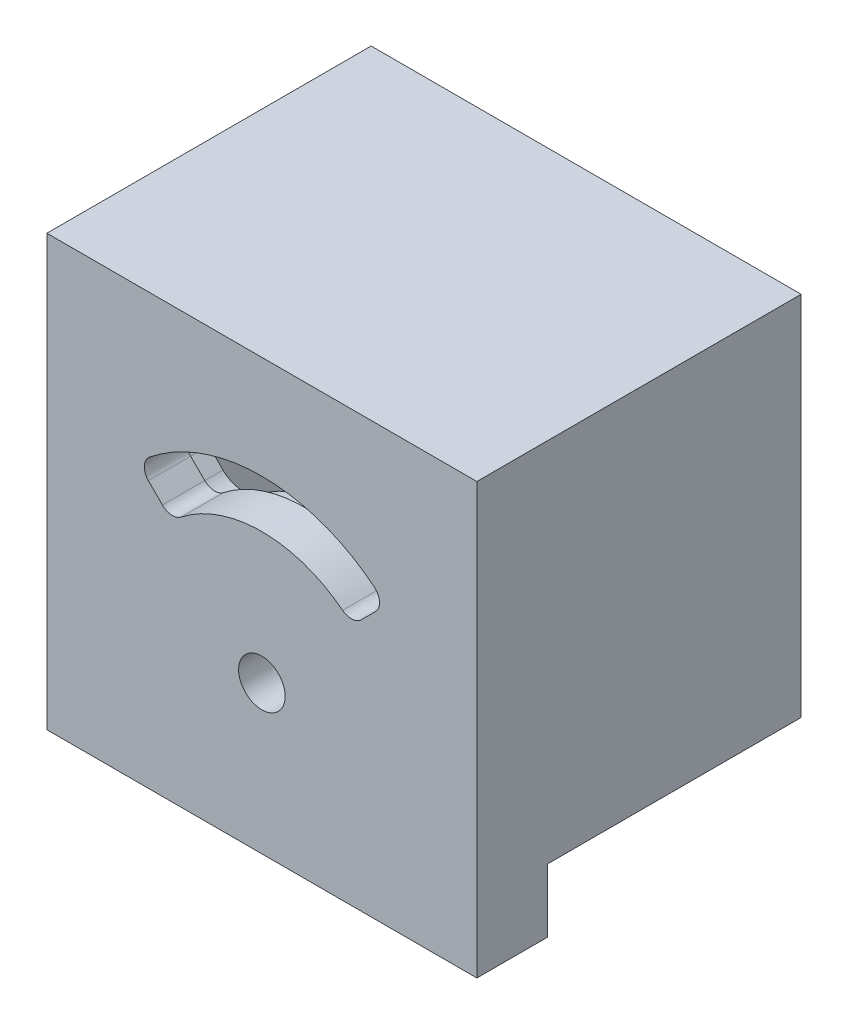
ISO-10303-21;
HEADER;
FILE_DESCRIPTION(('STEP AP214'),'2;1');
FILE_NAME('part.step','',(''),(''),'','','');
FILE_SCHEMA(('AUTOMOTIVE_DESIGN { 1 0 10303 214 1 1 1 1 }'));
ENDSEC;
DATA;
#1=APPLICATION_CONTEXT('core data for automotive mechanical design processes');
#2=APPLICATION_PROTOCOL_DEFINITION('international standard','automotive_design',2000,#1);
#3=PRODUCT_CONTEXT('',#1,'mechanical');
#4=PRODUCT('Part','Part','',(#3));
#5=PRODUCT_RELATED_PRODUCT_CATEGORY('part','',(#4));
#6=PRODUCT_DEFINITION_FORMATION('','',#4);
#7=PRODUCT_DEFINITION_CONTEXT('part definition',#1,'design');
#8=PRODUCT_DEFINITION('design','',#6,#7);
#9=PRODUCT_DEFINITION_SHAPE('','',#8);
#10=(LENGTH_UNIT() NAMED_UNIT(*) SI_UNIT(.MILLI.,.METRE.));
#11=(NAMED_UNIT(*) PLANE_ANGLE_UNIT() SI_UNIT($,.RADIAN.));
#12=(NAMED_UNIT(*) SI_UNIT($,.STERADIAN.) SOLID_ANGLE_UNIT());
#13=UNCERTAINTY_MEASURE_WITH_UNIT(LENGTH_MEASURE(1.E-05),#10,'distance_accuracy_value','');
#14=(GEOMETRIC_REPRESENTATION_CONTEXT(3) GLOBAL_UNCERTAINTY_ASSIGNED_CONTEXT((#13)) GLOBAL_UNIT_ASSIGNED_CONTEXT((#10,
#11,#12)) REPRESENTATION_CONTEXT('',''));
#15=CARTESIAN_POINT('',(0.,0.,0.));
#16=DIRECTION('',(0.,0.,1.));
#17=DIRECTION('',(1.,0.,0.));
#18=AXIS2_PLACEMENT_3D('',#15,#16,#17);
#19=CARTESIAN_POINT('',(0.,-1.09875,-5.));
#20=DIRECTION('',(0.,0.,-1.));
#21=DIRECTION('',(1.,0.,0.));
#22=AXIS2_PLACEMENT_3D('',#19,#20,#21);
#23=PLANE('',#22);
#24=CARTESIAN_POINT('',(0.,-4.75,-5.));
#25=DIRECTION('',(0.,0.,-1.));
#26=DIRECTION('',(-1.,0.,0.));
#27=AXIS2_PLACEMENT_3D('',#24,#25,#26);
#28=CIRCLE('',#27,1.65);
#29=CARTESIAN_POINT('',(-1.65,-4.75,-5.));
#30=VERTEX_POINT('',#29);
#31=EDGE_CURVE('E498',#30,#30,#28,.T.);
#32=ORIENTED_EDGE('',*,*,#31,.F.);
#33=EDGE_LOOP('',(#32));
#34=FACE_BOUND('',#33,.T.);
#35=CARTESIAN_POINT('',(0.,-4.75,-5.));
#36=DIRECTION('',(0.,0.,-1.));
#37=DIRECTION('',(-1.,0.,0.));
#38=AXIS2_PLACEMENT_3D('',#35,#36,#37);
#39=CIRCLE('',#38,8.3);
#40=CARTESIAN_POINT('',(-5.11380936571649,1.78750363450073,-5.));
#41=VERTEX_POINT('',#40);
#42=CARTESIAN_POINT('',(5.11380936571649,1.78750363450073,-5.));
#43=VERTEX_POINT('',#42);
#44=EDGE_CURVE('E490',#41,#43,#39,.T.);
#45=ORIENTED_EDGE('',*,*,#44,.T.);
#46=CARTESIAN_POINT('',(6.34605258637106,3.36280571510332,-5.));
#47=DIRECTION('',(0.,0.,1.));
#48=DIRECTION('',(-1.,0.,0.));
#49=AXIS2_PLACEMENT_3D('',#46,#47,#48);
#50=CIRCLE('',#49,2.);
#51=CARTESIAN_POINT('',(7.76026614874416,1.94859215273023,-5.));
#52=VERTEX_POINT('',#51);
#53=EDGE_CURVE('E488',#43,#52,#50,.T.);
#54=ORIENTED_EDGE('',*,*,#53,.T.);
#55=DIRECTION('',(-0.707106781186548,-0.707106781186548,0.));
#56=VECTOR('',#55,1.);
#57=CARTESIAN_POINT('',(8.25847771681434,2.44680372080041,-5.));
#58=LINE('',#57,#56);
#59=CARTESIAN_POINT('',(8.75668928488452,2.94501528887059,-5.));
#60=VERTEX_POINT('',#59);
#61=EDGE_CURVE('E485',#60,#52,#58,.T.);
#62=ORIENTED_EDGE('',*,*,#61,.F.);
#63=CARTESIAN_POINT('',(7.34247572251143,4.35922885124369,-5.));
#64=DIRECTION('',(0.,0.,1.));
#65=DIRECTION('',(-1.,0.,0.));
#66=AXIS2_PLACEMENT_3D('',#63,#64,#65);
#67=CIRCLE('',#66,2.);
#68=CARTESIAN_POINT('',(8.59759977764159,5.91636198820842,-5.));
#69=VERTEX_POINT('',#68);
#70=EDGE_CURVE('E483',#60,#69,#67,.T.);
#71=ORIENTED_EDGE('',*,*,#70,.T.);
#72=CARTESIAN_POINT('',(0.,-4.75,-5.));
#73=DIRECTION('',(0.,0.,-1.));
#74=DIRECTION('',(-1.,0.,0.));
#75=AXIS2_PLACEMENT_3D('',#72,#73,#74);
#76=CIRCLE('',#75,13.7);
#77=CARTESIAN_POINT('',(-8.59759977764158,5.91636198820842,-5.));
#78=VERTEX_POINT('',#77);
#79=EDGE_CURVE('E480',#78,#69,#76,.T.);
#80=ORIENTED_EDGE('',*,*,#79,.F.);
#81=CARTESIAN_POINT('',(-7.34247572251143,4.35922885124368,-5.));
#82=DIRECTION('',(0.,0.,1.));
#83=DIRECTION('',(-1.,0.,0.));
#84=AXIS2_PLACEMENT_3D('',#81,#82,#83);
#85=CIRCLE('',#84,2.);
#86=CARTESIAN_POINT('',(-8.75668928488452,2.94501528887058,-5.));
#87=VERTEX_POINT('',#86);
#88=EDGE_CURVE('E478',#78,#87,#85,.T.);
#89=ORIENTED_EDGE('',*,*,#88,.T.);
#90=DIRECTION('',(0.707106781186547,-0.707106781186548,0.));
#91=VECTOR('',#90,1.);
#92=CARTESIAN_POINT('',(-8.25847771681434,2.44680372080041,-5.));
#93=LINE('',#92,#91);
#94=CARTESIAN_POINT('',(-7.76026614874417,1.94859215273023,-5.));
#95=VERTEX_POINT('',#94);
#96=EDGE_CURVE('E476',#87,#95,#93,.T.);
#97=ORIENTED_EDGE('',*,*,#96,.T.);
#98=CARTESIAN_POINT('',(-6.34605258637107,3.36280571510332,-5.));
#99=DIRECTION('',(0.,0.,1.));
#100=DIRECTION('',(-1.,0.,0.));
#101=AXIS2_PLACEMENT_3D('',#98,#99,#100);
#102=CIRCLE('',#101,2.);
#103=EDGE_CURVE('E474',#95,#41,#102,.T.);
#104=ORIENTED_EDGE('',*,*,#103,.T.);
#105=EDGE_LOOP('',(#45,#54,#62,#71,#80,#89,#97,#104));
#106=FACE_BOUND('',#105,.T.);
#107=DIRECTION('',(0.,1.,0.));
#108=VECTOR('',#107,1.);
#109=CARTESIAN_POINT('',(12.25,15.25,-5.));
#110=LINE('',#109,#108);
#111=CARTESIAN_POINT('',(12.25,-10.75,-5.));
#112=VERTEX_POINT('',#111);
#113=CARTESIAN_POINT('',(12.25,12.25,-5.));
#114=VERTEX_POINT('',#113);
#115=EDGE_CURVE('E237',#112,#114,#110,.T.);
#116=ORIENTED_EDGE('',*,*,#115,.F.);
#117=DIRECTION('',(-1.,0.,0.));
#118=VECTOR('',#117,1.);
#119=CARTESIAN_POINT('',(15.25,-10.75,-5.));
#120=LINE('',#119,#118);
#121=CARTESIAN_POINT('',(15.25,-10.75,-5.));
#122=VERTEX_POINT('',#121);
#123=EDGE_CURVE('E885',#122,#112,#120,.T.);
#124=ORIENTED_EDGE('',*,*,#123,.F.);
#125=DIRECTION('',(0.,1.,0.));
#126=VECTOR('',#125,1.);
#127=CARTESIAN_POINT('',(15.25,-15.25,-5.));
#128=LINE('',#127,#126);
#129=CARTESIAN_POINT('',(15.25,-15.25,-5.));
#130=VERTEX_POINT('',#129);
#131=EDGE_CURVE('E242',#130,#122,#128,.T.);
#132=ORIENTED_EDGE('',*,*,#131,.F.);
#133=DIRECTION('',(1.,0.,0.));
#134=VECTOR('',#133,1.);
#135=CARTESIAN_POINT('',(-15.25,-15.25,-5.));
#136=LINE('',#135,#134);
#137=CARTESIAN_POINT('',(-15.25,-15.25,-5.));
#138=VERTEX_POINT('',#137);
#139=EDGE_CURVE('E493',#138,#130,#136,.T.);
#140=ORIENTED_EDGE('',*,*,#139,.F.);
#141=DIRECTION('',(0.,-1.,0.));
#142=VECTOR('',#141,1.);
#143=CARTESIAN_POINT('',(-15.25,15.25,-5.));
#144=LINE('',#143,#142);
#145=CARTESIAN_POINT('',(-15.25,-10.75,-5.));
#146=VERTEX_POINT('',#145);
#147=EDGE_CURVE('E41',#146,#138,#144,.T.);
#148=ORIENTED_EDGE('',*,*,#147,.F.);
#149=DIRECTION('',(-1.,0.,0.));
#150=VECTOR('',#149,1.);
#151=CARTESIAN_POINT('',(-12.25,-10.75,-5.));
#152=LINE('',#151,#150);
#153=CARTESIAN_POINT('',(-12.25,-10.75,-5.));
#154=VERTEX_POINT('',#153);
#155=EDGE_CURVE('E253',#154,#146,#152,.T.);
#156=ORIENTED_EDGE('',*,*,#155,.F.);
#157=DIRECTION('',(0.,-1.,0.));
#158=VECTOR('',#157,1.);
#159=CARTESIAN_POINT('',(-12.25,15.25,-5.));
#160=LINE('',#159,#158);
#161=CARTESIAN_POINT('',(-12.25,12.25,-5.));
#162=VERTEX_POINT('',#161);
#163=EDGE_CURVE('E245',#162,#154,#160,.T.);
#164=ORIENTED_EDGE('',*,*,#163,.F.);
#165=DIRECTION('',(-1.,0.,0.));
#166=VECTOR('',#165,1.);
#167=CARTESIAN_POINT('',(15.25,12.25,-5.));
#168=LINE('',#167,#166);
#169=EDGE_CURVE('E227',#114,#162,#168,.T.);
#170=ORIENTED_EDGE('',*,*,#169,.F.);
#171=EDGE_LOOP('',(#116,#124,#132,#140,#148,#156,#164,#170));
#172=FACE_BOUND('',#171,.T.);
#173=ADVANCED_FACE('F37',(#34,#106,#172),#23,.T.);
#174=CARTESIAN_POINT('',(15.25,12.25,-23.));
#175=DIRECTION('',(0.,1.,0.));
#176=DIRECTION('',(0.,0.,1.));
#177=AXIS2_PLACEMENT_3D('',#174,#175,#176);
#178=PLANE('',#177);
#179=DIRECTION('',(0.,0.,-1.));
#180=VECTOR('',#179,1.);
#181=CARTESIAN_POINT('',(12.25,12.25,-23.));
#182=LINE('',#181,#180);
#183=CARTESIAN_POINT('',(12.25,12.25,-23.));
#184=VERTEX_POINT('',#183);
#185=EDGE_CURVE('E243',#114,#184,#182,.T.);
#186=ORIENTED_EDGE('',*,*,#185,.F.);
#187=ORIENTED_EDGE('',*,*,#169,.T.);
#188=DIRECTION('',(0.,0.,1.));
#189=VECTOR('',#188,1.);
#190=CARTESIAN_POINT('',(-12.25,12.25,-23.));
#191=LINE('',#190,#189);
#192=CARTESIAN_POINT('',(-12.25,12.25,-23.));
#193=VERTEX_POINT('',#192);
#194=EDGE_CURVE('E264',#193,#162,#191,.T.);
#195=ORIENTED_EDGE('',*,*,#194,.F.);
#196=DIRECTION('',(-1.,0.,0.));
#197=VECTOR('',#196,1.);
#198=CARTESIAN_POINT('',(15.25,12.25,-23.));
#199=LINE('',#198,#197);
#200=EDGE_CURVE('E226',#184,#193,#199,.T.);
#201=ORIENTED_EDGE('',*,*,#200,.F.);
#202=EDGE_LOOP('',(#186,#187,#195,#201));
#203=FACE_BOUND('',#202,.T.);
#204=ADVANCED_FACE('F568',(#203),#178,.F.);
#205=CARTESIAN_POINT('',(0.,-4.75,-5.));
#206=DIRECTION('',(0.,0.,1.));
#207=DIRECTION('',(1.,0.,0.));
#208=AXIS2_PLACEMENT_3D('',#205,#206,#207);
#209=CYLINDRICAL_SURFACE('',#208,12.7);
#210=DIRECTION('',(0.,0.,1.));
#211=VECTOR('',#210,1.);
#212=CARTESIAN_POINT('',(-7.9700377500765,5.13779541972605,-5.));
#213=LINE('',#212,#211);
#214=CARTESIAN_POINT('',(-7.97003775007651,5.13779541972605,0.));
#215=VERTEX_POINT('',#214);
#216=CARTESIAN_POINT('',(-7.97003775007651,5.13779541972605,-3.));
#217=VERTEX_POINT('',#216);
#218=EDGE_CURVE('E11',#215,#217,#213,.F.);
#219=ORIENTED_EDGE('',*,*,#218,.T.);
#220=CARTESIAN_POINT('',(0.,-4.75,-3.));
#221=DIRECTION('',(0.,0.,-1.));
#222=DIRECTION('',(-1.,0.,0.));
#223=AXIS2_PLACEMENT_3D('',#220,#221,#222);
#224=CIRCLE('',#223,12.7);
#225=CARTESIAN_POINT('',(7.9700377500765,5.13779541972605,-3.));
#226=VERTEX_POINT('',#225);
#227=EDGE_CURVE('E47',#217,#226,#224,.T.);
#228=ORIENTED_EDGE('',*,*,#227,.T.);
#229=DIRECTION('',(0.,0.,1.));
#230=VECTOR('',#229,1.);
#231=CARTESIAN_POINT('',(7.97003775007651,5.13779541972605,-5.));
#232=LINE('',#231,#230);
#233=CARTESIAN_POINT('',(7.9700377500765,5.13779541972605,0.));
#234=VERTEX_POINT('',#233);
#235=EDGE_CURVE('E533',#226,#234,#232,.T.);
#236=ORIENTED_EDGE('',*,*,#235,.T.);
#237=CARTESIAN_POINT('',(0.,-4.75,0.));
#238=DIRECTION('',(0.,0.,-1.));
#239=DIRECTION('',(-1.,0.,0.));
#240=AXIS2_PLACEMENT_3D('',#237,#238,#239);
#241=CIRCLE('',#240,12.7);
#242=EDGE_CURVE('E530',#215,#234,#241,.T.);
#243=ORIENTED_EDGE('',*,*,#242,.F.);
#244=EDGE_LOOP('',(#219,#228,#236,#243));
#245=FACE_BOUND('',#244,.T.);
#246=ADVANCED_FACE('F39',(#245),#209,.F.);
#247=CARTESIAN_POINT('',(-8.18900691705113,3.79154648341029,-5.));
#248=DIRECTION('',(-0.707106781186548,-0.707106781186547,0.));
#249=DIRECTION('',(0.707106781186547,-0.707106781186548,0.));
#250=AXIS2_PLACEMENT_3D('',#247,#248,#249);
#251=PLANE('',#250);
#252=DIRECTION('',(0.707106781186547,-0.707106781186548,0.));
#253=VECTOR('',#252,1.);
#254=CARTESIAN_POINT('',(-8.18900691705113,3.79154648341029,-3.));
#255=LINE('',#254,#253);
#256=CARTESIAN_POINT('',(-8.04958250369797,3.65212207005713,-3.));
#257=VERTEX_POINT('',#256);
#258=CARTESIAN_POINT('',(-7.05315936755762,2.65569893391677,-3.));
#259=VERTEX_POINT('',#258);
#260=EDGE_CURVE('E527',#257,#259,#255,.T.);
#261=ORIENTED_EDGE('',*,*,#260,.F.);
#262=DIRECTION('',(0.,0.,1.));
#263=VECTOR('',#262,1.);
#264=CARTESIAN_POINT('',(-8.04958250369797,3.65212207005713,-5.));
#265=LINE('',#264,#263);
#266=CARTESIAN_POINT('',(-8.04958250369797,3.65212207005713,0.));
#267=VERTEX_POINT('',#266);
#268=EDGE_CURVE('E525',#257,#267,#265,.T.);
#269=ORIENTED_EDGE('',*,*,#268,.T.);
#270=DIRECTION('',(0.707106781186547,-0.707106781186548,0.));
#271=VECTOR('',#270,1.);
#272=CARTESIAN_POINT('',(-8.18900691705113,3.79154648341029,0.));
#273=LINE('',#272,#271);
#274=CARTESIAN_POINT('',(-7.05315936755762,2.65569893391677,0.));
#275=VERTEX_POINT('',#274);
#276=EDGE_CURVE('E523',#267,#275,#273,.T.);
#277=ORIENTED_EDGE('',*,*,#276,.T.);
#278=DIRECTION('',(0.,0.,-1.));
#279=VECTOR('',#278,1.);
#280=CARTESIAN_POINT('',(-7.05315936755762,2.65569893391677,-5.));
#281=LINE('',#280,#279);
#282=EDGE_CURVE('E521',#275,#259,#281,.T.);
#283=ORIENTED_EDGE('',*,*,#282,.T.);
#284=EDGE_LOOP('',(#261,#269,#277,#283));
#285=FACE_BOUND('',#284,.T.);
#286=ADVANCED_FACE('F590',(#285),#251,.F.);
#287=CARTESIAN_POINT('',(0.,-4.75,-5.));
#288=DIRECTION('',(0.,0.,1.));
#289=DIRECTION('',(1.,0.,0.));
#290=AXIS2_PLACEMENT_3D('',#287,#288,#289);
#291=CYLINDRICAL_SURFACE('',#290,9.3);
#292=CARTESIAN_POINT('',(0.,-4.75,-3.));
#293=DIRECTION('',(0.,0.,-1.));
#294=DIRECTION('',(-1.,0.,0.));
#295=AXIS2_PLACEMENT_3D('',#292,#293,#294);
#296=CIRCLE('',#295,9.3);
#297=CARTESIAN_POINT('',(-5.72993097604378,2.57515467480203,-3.));
#298=VERTEX_POINT('',#297);
#299=CARTESIAN_POINT('',(5.72993097604378,2.57515467480203,-3.));
#300=VERTEX_POINT('',#299);
#301=EDGE_CURVE('E518',#298,#300,#296,.T.);
#302=ORIENTED_EDGE('',*,*,#301,.F.);
#303=DIRECTION('',(0.,0.,1.));
#304=VECTOR('',#303,1.);
#305=CARTESIAN_POINT('',(-5.72993097604378,2.57515467480203,-5.));
#306=LINE('',#305,#304);
#307=CARTESIAN_POINT('',(-5.72993097604378,2.57515467480203,0.));
#308=VERTEX_POINT('',#307);
#309=EDGE_CURVE('E516',#298,#308,#306,.T.);
#310=ORIENTED_EDGE('',*,*,#309,.T.);
#311=CARTESIAN_POINT('',(0.,-4.75,0.));
#312=DIRECTION('',(0.,0.,-1.));
#313=DIRECTION('',(-1.,0.,0.));
#314=AXIS2_PLACEMENT_3D('',#311,#312,#313);
#315=CIRCLE('',#314,9.3);
#316=CARTESIAN_POINT('',(5.72993097604378,2.57515467480203,0.));
#317=VERTEX_POINT('',#316);
#318=EDGE_CURVE('E514',#308,#317,#315,.T.);
#319=ORIENTED_EDGE('',*,*,#318,.T.);
#320=DIRECTION('',(0.,0.,1.));
#321=VECTOR('',#320,1.);
#322=CARTESIAN_POINT('',(5.72993097604378,2.57515467480203,-5.));
#323=LINE('',#322,#321);
#324=EDGE_CURVE('E512',#317,#300,#323,.F.);
#325=ORIENTED_EDGE('',*,*,#324,.T.);
#326=EDGE_LOOP('',(#302,#310,#319,#325));
#327=FACE_BOUND('',#326,.T.);
#328=ADVANCED_FACE('F587',(#327),#291,.T.);
#329=CARTESIAN_POINT('',(8.18900691705112,3.79154648341028,-5.));
#330=DIRECTION('',(-0.707106781186547,0.707106781186548,0.));
#331=DIRECTION('',(-0.707106781186548,-0.707106781186547,0.));
#332=AXIS2_PLACEMENT_3D('',#329,#330,#331);
#333=PLANE('',#332);
#334=DIRECTION('',(0.,0.,-1.));
#335=VECTOR('',#334,1.);
#336=CARTESIAN_POINT('',(8.04958250369798,3.65212207005714,-5.));
#337=LINE('',#336,#335);
#338=CARTESIAN_POINT('',(8.04958250369798,3.65212207005714,0.));
#339=VERTEX_POINT('',#338);
#340=CARTESIAN_POINT('',(8.04958250369798,3.65212207005714,-3.));
#341=VERTEX_POINT('',#340);
#342=EDGE_CURVE('E510',#339,#341,#337,.T.);
#343=ORIENTED_EDGE('',*,*,#342,.T.);
#344=DIRECTION('',(-0.707106781186548,-0.707106781186547,0.));
#345=VECTOR('',#344,1.);
#346=CARTESIAN_POINT('',(8.18900691705112,3.79154648341028,-3.));
#347=LINE('',#346,#345);
#348=CARTESIAN_POINT('',(7.05315936755761,2.65569893391677,-3.));
#349=VERTEX_POINT('',#348);
#350=EDGE_CURVE('E508',#341,#349,#347,.T.);
#351=ORIENTED_EDGE('',*,*,#350,.T.);
#352=DIRECTION('',(0.,0.,1.));
#353=VECTOR('',#352,1.);
#354=CARTESIAN_POINT('',(7.05315936755761,2.65569893391677,-5.));
#355=LINE('',#354,#353);
#356=CARTESIAN_POINT('',(7.05315936755761,2.65569893391677,0.));
#357=VERTEX_POINT('',#356);
#358=EDGE_CURVE('E506',#349,#357,#355,.T.);
#359=ORIENTED_EDGE('',*,*,#358,.T.);
#360=DIRECTION('',(-0.707106781186548,-0.707106781186547,0.));
#361=VECTOR('',#360,1.);
#362=CARTESIAN_POINT('',(8.18900691705112,3.79154648341028,0.));
#363=LINE('',#362,#361);
#364=EDGE_CURVE('E503',#339,#357,#363,.T.);
#365=ORIENTED_EDGE('',*,*,#364,.F.);
#366=EDGE_LOOP('',(#343,#351,#359,#365));
#367=FACE_BOUND('',#366,.T.);
#368=ADVANCED_FACE('F584',(#367),#333,.T.);
#369=CARTESIAN_POINT('',(-7.34247572251142,4.35922885124368,-5.));
#370=DIRECTION('',(0.,0.,1.));
#371=DIRECTION('',(1.,0.,0.));
#372=AXIS2_PLACEMENT_3D('',#369,#370,#371);
#373=CYLINDRICAL_SURFACE('',#372,1.);
#374=CARTESIAN_POINT('',(-7.34247572251142,4.35922885124368,-3.));
#375=DIRECTION('',(0.,0.,-1.));
#376=DIRECTION('',(-1.,0.,0.));
#377=AXIS2_PLACEMENT_3D('',#374,#375,#376);
#378=CIRCLE('',#377,1.);
#379=EDGE_CURVE('E471',#217,#257,#378,.F.);
#380=ORIENTED_EDGE('',*,*,#379,.F.);
#381=ORIENTED_EDGE('',*,*,#218,.F.);
#382=CARTESIAN_POINT('',(-7.34247572251142,4.35922885124368,0.));
#383=DIRECTION('',(0.,0.,-1.));
#384=DIRECTION('',(-1.,0.,0.));
#385=AXIS2_PLACEMENT_3D('',#382,#383,#384);
#386=CIRCLE('',#385,1.);
#387=EDGE_CURVE('E468',#267,#215,#386,.T.);
#388=ORIENTED_EDGE('',*,*,#387,.F.);
#389=ORIENTED_EDGE('',*,*,#268,.F.);
#390=EDGE_LOOP('',(#380,#381,#388,#389));
#391=FACE_BOUND('',#390,.T.);
#392=ADVANCED_FACE('F582',(#391),#373,.F.);
#393=CARTESIAN_POINT('',(7.34247572251143,4.35922885124368,-5.));
#394=DIRECTION('',(0.,0.,1.));
#395=DIRECTION('',(1.,0.,0.));
#396=AXIS2_PLACEMENT_3D('',#393,#394,#395);
#397=CYLINDRICAL_SURFACE('',#396,1.);
#398=CARTESIAN_POINT('',(7.34247572251143,4.35922885124368,-3.));
#399=DIRECTION('',(0.,0.,-1.));
#400=DIRECTION('',(-1.,0.,0.));
#401=AXIS2_PLACEMENT_3D('',#398,#399,#400);
#402=CIRCLE('',#401,1.);
#403=EDGE_CURVE('E465',#341,#226,#402,.F.);
#404=ORIENTED_EDGE('',*,*,#403,.F.);
#405=ORIENTED_EDGE('',*,*,#342,.F.);
#406=CARTESIAN_POINT('',(7.34247572251143,4.35922885124368,0.));
#407=DIRECTION('',(0.,0.,-1.));
#408=DIRECTION('',(-1.,0.,0.));
#409=AXIS2_PLACEMENT_3D('',#406,#407,#408);
#410=CIRCLE('',#409,1.);
#411=EDGE_CURVE('E462',#234,#339,#410,.T.);
#412=ORIENTED_EDGE('',*,*,#411,.F.);
#413=ORIENTED_EDGE('',*,*,#235,.F.);
#414=EDGE_LOOP('',(#404,#405,#412,#413));
#415=FACE_BOUND('',#414,.T.);
#416=ADVANCED_FACE('F610',(#415),#397,.F.);
#417=CARTESIAN_POINT('',(6.34605258637106,3.36280571510332,-5.));
#418=DIRECTION('',(0.,0.,1.));
#419=DIRECTION('',(1.,0.,0.));
#420=AXIS2_PLACEMENT_3D('',#417,#418,#419);
#421=CYLINDRICAL_SURFACE('',#420,1.);
#422=CARTESIAN_POINT('',(6.34605258637106,3.36280571510332,-3.));
#423=DIRECTION('',(0.,0.,-1.));
#424=DIRECTION('',(-1.,0.,0.));
#425=AXIS2_PLACEMENT_3D('',#422,#423,#424);
#426=CIRCLE('',#425,1.);
#427=EDGE_CURVE('E459',#300,#349,#426,.F.);
#428=ORIENTED_EDGE('',*,*,#427,.F.);
#429=ORIENTED_EDGE('',*,*,#324,.F.);
#430=CARTESIAN_POINT('',(6.34605258637106,3.36280571510332,0.));
#431=DIRECTION('',(0.,0.,-1.));
#432=DIRECTION('',(-1.,0.,0.));
#433=AXIS2_PLACEMENT_3D('',#430,#431,#432);
#434=CIRCLE('',#433,1.);
#435=EDGE_CURVE('E456',#357,#317,#434,.T.);
#436=ORIENTED_EDGE('',*,*,#435,.F.);
#437=ORIENTED_EDGE('',*,*,#358,.F.);
#438=EDGE_LOOP('',(#428,#429,#436,#437));
#439=FACE_BOUND('',#438,.T.);
#440=ADVANCED_FACE('F622',(#439),#421,.F.);
#441=CARTESIAN_POINT('',(-6.34605258637107,3.36280571510332,-5.));
#442=DIRECTION('',(0.,0.,1.));
#443=DIRECTION('',(1.,0.,0.));
#444=AXIS2_PLACEMENT_3D('',#441,#442,#443);
#445=CYLINDRICAL_SURFACE('',#444,1.);
#446=CARTESIAN_POINT('',(-6.34605258637107,3.36280571510332,-3.));
#447=DIRECTION('',(0.,0.,-1.));
#448=DIRECTION('',(-1.,0.,0.));
#449=AXIS2_PLACEMENT_3D('',#446,#447,#448);
#450=CIRCLE('',#449,1.);
#451=EDGE_CURVE('E453',#259,#298,#450,.F.);
#452=ORIENTED_EDGE('',*,*,#451,.F.);
#453=ORIENTED_EDGE('',*,*,#282,.F.);
#454=CARTESIAN_POINT('',(-6.34605258637107,3.36280571510332,0.));
#455=DIRECTION('',(0.,0.,-1.));
#456=DIRECTION('',(-1.,0.,0.));
#457=AXIS2_PLACEMENT_3D('',#454,#455,#456);
#458=CIRCLE('',#457,1.);
#459=EDGE_CURVE('E448',#308,#275,#458,.T.);
#460=ORIENTED_EDGE('',*,*,#459,.F.);
#461=ORIENTED_EDGE('',*,*,#309,.F.);
#462=EDGE_LOOP('',(#452,#453,#460,#461));
#463=FACE_BOUND('',#462,.T.);
#464=ADVANCED_FACE('F615',(#463),#445,.F.);
#465=CARTESIAN_POINT('',(15.25,-15.25,-5.));
#466=DIRECTION('',(1.,0.,0.));
#467=DIRECTION('',(0.,1.,0.));
#468=AXIS2_PLACEMENT_3D('',#465,#466,#467);
#469=PLANE('',#468);
#470=DIRECTION('',(0.,0.,1.));
#471=VECTOR('',#470,1.);
#472=CARTESIAN_POINT('',(15.25,15.25,-23.));
#473=LINE('',#472,#471);
#474=CARTESIAN_POINT('',(15.25,15.25,-23.));
#475=VERTEX_POINT('',#474);
#476=CARTESIAN_POINT('',(15.25,15.25,-5.));
#477=VERTEX_POINT('',#476);
#478=EDGE_CURVE('E271',#475,#477,#473,.T.);
#479=ORIENTED_EDGE('',*,*,#478,.T.);
#480=CARTESIAN_POINT('',(15.25,15.25,-5.));
#481=DIRECTION('',(0.,0.,1.));
#482=VECTOR('',#481,1.);
#483=LINE('',#480,#482);
#484=CARTESIAN_POINT('',(15.25,15.25,0.));
#485=VERTEX_POINT('',#484);
#486=EDGE_CURVE('E358',#477,#485,#483,.T.);
#487=ORIENTED_EDGE('',*,*,#486,.T.);
#488=DIRECTION('',(0.,1.,0.));
#489=VECTOR('',#488,1.);
#490=CARTESIAN_POINT('',(15.25,-15.25,0.));
#491=LINE('',#490,#489);
#492=CARTESIAN_POINT('',(15.25,-15.25,0.));
#493=VERTEX_POINT('',#492);
#494=EDGE_CURVE('E445',#493,#485,#491,.T.);
#495=ORIENTED_EDGE('',*,*,#494,.F.);
#496=CARTESIAN_POINT('',(15.25,-15.25,-5.));
#497=DIRECTION('',(0.,0.,1.));
#498=VECTOR('',#497,1.);
#499=LINE('',#496,#498);
#500=EDGE_CURVE('E444',#130,#493,#499,.T.);
#501=ORIENTED_EDGE('',*,*,#500,.F.);
#502=ORIENTED_EDGE('',*,*,#131,.T.);
#503=DIRECTION('',(0.,0.,1.));
#504=VECTOR('',#503,1.);
#505=CARTESIAN_POINT('',(15.25,-10.75,-23.));
#506=LINE('',#505,#504);
#507=CARTESIAN_POINT('',(15.25,-10.75,-23.));
#508=VERTEX_POINT('',#507);
#509=EDGE_CURVE('E231',#508,#122,#506,.T.);
#510=ORIENTED_EDGE('',*,*,#509,.F.);
#511=DIRECTION('',(0.,-1.,0.));
#512=VECTOR('',#511,1.);
#513=CARTESIAN_POINT('',(15.25,15.25,-23.));
#514=LINE('',#513,#512);
#515=EDGE_CURVE('E214',#475,#508,#514,.T.);
#516=ORIENTED_EDGE('',*,*,#515,.F.);
#517=EDGE_LOOP('',(#479,#487,#495,#501,#502,#510,#516));
#518=FACE_BOUND('',#517,.T.);
#519=ADVANCED_FACE('F240',(#518),#469,.T.);
#520=CARTESIAN_POINT('',(-15.25,-15.25,-5.));
#521=DIRECTION('',(0.,-1.,0.));
#522=DIRECTION('',(1.,0.,0.));
#523=AXIS2_PLACEMENT_3D('',#520,#521,#522);
#524=PLANE('',#523);
#525=DIRECTION('',(1.,0.,0.));
#526=VECTOR('',#525,1.);
#527=CARTESIAN_POINT('',(-15.25,-15.25,0.));
#528=LINE('',#527,#526);
#529=CARTESIAN_POINT('',(-15.25,-15.25,0.));
#530=VERTEX_POINT('',#529);
#531=EDGE_CURVE('E421',#530,#493,#528,.T.);
#532=ORIENTED_EDGE('',*,*,#531,.F.);
#533=CARTESIAN_POINT('',(-15.25,-15.25,-5.));
#534=DIRECTION('',(0.,0.,1.));
#535=VECTOR('',#534,1.);
#536=LINE('',#533,#535);
#537=EDGE_CURVE('E376',#138,#530,#536,.T.);
#538=ORIENTED_EDGE('',*,*,#537,.F.);
#539=ORIENTED_EDGE('',*,*,#139,.T.);
#540=ORIENTED_EDGE('',*,*,#500,.T.);
#541=EDGE_LOOP('',(#532,#538,#539,#540));
#542=FACE_BOUND('',#541,.T.);
#543=ADVANCED_FACE('F398',(#542),#524,.T.);
#544=CARTESIAN_POINT('',(-15.25,15.25,-5.));
#545=DIRECTION('',(-1.,0.,0.));
#546=DIRECTION('',(0.,-1.,0.));
#547=AXIS2_PLACEMENT_3D('',#544,#545,#546);
#548=PLANE('',#547);
#549=CARTESIAN_POINT('',(-15.25,15.25,-5.));
#550=DIRECTION('',(0.,0.,1.));
#551=VECTOR('',#550,1.);
#552=LINE('',#549,#551);
#553=CARTESIAN_POINT('',(-15.25,15.25,-5.));
#554=VERTEX_POINT('',#553);
#555=CARTESIAN_POINT('',(-15.25,15.25,0.));
#556=VERTEX_POINT('',#555);
#557=EDGE_CURVE('E361',#554,#556,#552,.T.);
#558=ORIENTED_EDGE('',*,*,#557,.F.);
#559=DIRECTION('',(0.,0.,1.));
#560=VECTOR('',#559,1.);
#561=CARTESIAN_POINT('',(-15.25,15.25,-23.));
#562=LINE('',#561,#560);
#563=CARTESIAN_POINT('',(-15.25,15.25,-23.));
#564=VERTEX_POINT('',#563);
#565=EDGE_CURVE('E277',#564,#554,#562,.T.);
#566=ORIENTED_EDGE('',*,*,#565,.F.);
#567=DIRECTION('',(0.,1.,0.));
#568=VECTOR('',#567,1.);
#569=CARTESIAN_POINT('',(-15.25,15.25,-23.));
#570=LINE('',#569,#568);
#571=CARTESIAN_POINT('',(-15.25,-10.75,-23.));
#572=VERTEX_POINT('',#571);
#573=EDGE_CURVE('E268',#572,#564,#570,.T.);
#574=ORIENTED_EDGE('',*,*,#573,.F.);
#575=DIRECTION('',(0.,0.,1.));
#576=VECTOR('',#575,1.);
#577=CARTESIAN_POINT('',(-15.25,-10.75,-23.));
#578=LINE('',#577,#576);
#579=EDGE_CURVE('E256',#572,#146,#578,.T.);
#580=ORIENTED_EDGE('',*,*,#579,.T.);
#581=ORIENTED_EDGE('',*,*,#147,.T.);
#582=ORIENTED_EDGE('',*,*,#537,.T.);
#583=DIRECTION('',(0.,-1.,0.));
#584=VECTOR('',#583,1.);
#585=CARTESIAN_POINT('',(-15.25,15.25,0.));
#586=LINE('',#585,#584);
#587=EDGE_CURVE('E389',#556,#530,#586,.T.);
#588=ORIENTED_EDGE('',*,*,#587,.F.);
#589=EDGE_LOOP('',(#558,#566,#574,#580,#581,#582,#588));
#590=FACE_BOUND('',#589,.T.);
#591=ADVANCED_FACE('F342',(#590),#548,.T.);
#592=CARTESIAN_POINT('',(15.25,15.25,-5.));
#593=DIRECTION('',(0.,1.,0.));
#594=DIRECTION('',(-1.,0.,0.));
#595=AXIS2_PLACEMENT_3D('',#592,#593,#594);
#596=PLANE('',#595);
#597=ORIENTED_EDGE('',*,*,#478,.F.);
#598=DIRECTION('',(1.,0.,0.));
#599=VECTOR('',#598,1.);
#600=CARTESIAN_POINT('',(15.25,15.25,-23.));
#601=LINE('',#600,#599);
#602=EDGE_CURVE('E221',#564,#475,#601,.T.);
#603=ORIENTED_EDGE('',*,*,#602,.F.);
#604=ORIENTED_EDGE('',*,*,#565,.T.);
#605=ORIENTED_EDGE('',*,*,#557,.T.);
#606=DIRECTION('',(-1.,0.,0.));
#607=VECTOR('',#606,1.);
#608=CARTESIAN_POINT('',(15.25,15.25,0.));
#609=LINE('',#608,#607);
#610=EDGE_CURVE('E324',#485,#556,#609,.T.);
#611=ORIENTED_EDGE('',*,*,#610,.F.);
#612=ORIENTED_EDGE('',*,*,#486,.F.);
#613=EDGE_LOOP('',(#597,#603,#604,#605,#611,#612));
#614=FACE_BOUND('',#613,.T.);
#615=ADVANCED_FACE('F331',(#614),#596,.T.);
#616=CARTESIAN_POINT('',(0.,-4.75,-5.));
#617=DIRECTION('',(0.,0.,1.));
#618=DIRECTION('',(1.,0.,0.));
#619=AXIS2_PLACEMENT_3D('',#616,#617,#618);
#620=CYLINDRICAL_SURFACE('',#619,1.65);
#621=ORIENTED_EDGE('',*,*,#31,.T.);
#622=EDGE_LOOP('',(#621));
#623=FACE_BOUND('',#622,.T.);
#624=CARTESIAN_POINT('',(0.,-4.75,0.));
#625=DIRECTION('',(0.,0.,-1.));
#626=DIRECTION('',(-1.,0.,0.));
#627=AXIS2_PLACEMENT_3D('',#624,#625,#626);
#628=CIRCLE('',#627,1.65);
#629=CARTESIAN_POINT('',(-1.65,-4.75,0.));
#630=VERTEX_POINT('',#629);
#631=EDGE_CURVE('E321',#630,#630,#628,.T.);
#632=ORIENTED_EDGE('',*,*,#631,.F.);
#633=EDGE_LOOP('',(#632));
#634=FACE_BOUND('',#633,.T.);
#635=ADVANCED_FACE('F341',(#623,#634),#620,.F.);
#636=CARTESIAN_POINT('',(0.,-1.09875,0.));
#637=DIRECTION('',(0.,0.,-1.));
#638=DIRECTION('',(1.,0.,0.));
#639=AXIS2_PLACEMENT_3D('',#636,#637,#638);
#640=PLANE('',#639);
#641=ORIENTED_EDGE('',*,*,#276,.F.);
#642=ORIENTED_EDGE('',*,*,#387,.T.);
#643=ORIENTED_EDGE('',*,*,#242,.T.);
#644=ORIENTED_EDGE('',*,*,#411,.T.);
#645=ORIENTED_EDGE('',*,*,#364,.T.);
#646=ORIENTED_EDGE('',*,*,#435,.T.);
#647=ORIENTED_EDGE('',*,*,#318,.F.);
#648=ORIENTED_EDGE('',*,*,#459,.T.);
#649=EDGE_LOOP('',(#641,#642,#643,#644,#645,#646,#647,#648));
#650=FACE_BOUND('',#649,.T.);
#651=ORIENTED_EDGE('',*,*,#494,.T.);
#652=ORIENTED_EDGE('',*,*,#610,.T.);
#653=ORIENTED_EDGE('',*,*,#587,.T.);
#654=ORIENTED_EDGE('',*,*,#531,.T.);
#655=EDGE_LOOP('',(#651,#652,#653,#654));
#656=FACE_BOUND('',#655,.T.);
#657=ORIENTED_EDGE('',*,*,#631,.T.);
#658=EDGE_LOOP('',(#657));
#659=FACE_BOUND('',#658,.T.);
#660=ADVANCED_FACE('F554',(#650,#656,#659),#640,.F.);
#661=CARTESIAN_POINT('',(6.34605258637106,3.36280571510332,-3.));
#662=DIRECTION('',(0.,0.,-1.));
#663=DIRECTION('',(-1.,0.,0.));
#664=AXIS2_PLACEMENT_3D('',#661,#662,#663);
#665=CYLINDRICAL_SURFACE('',#664,2.);
#666=ORIENTED_EDGE('',*,*,#53,.F.);
#667=DIRECTION('',(0.,0.,-1.));
#668=VECTOR('',#667,1.);
#669=CARTESIAN_POINT('',(5.11380936571649,1.78750363450073,-3.));
#670=LINE('',#669,#668);
#671=CARTESIAN_POINT('',(5.11380936571649,1.78750363450073,-3.));
#672=VERTEX_POINT('',#671);
#673=EDGE_CURVE('E318',#672,#43,#670,.T.);
#674=ORIENTED_EDGE('',*,*,#673,.F.);
#675=CARTESIAN_POINT('',(6.34605258637106,3.36280571510332,-3.));
#676=DIRECTION('',(0.,0.,1.));
#677=DIRECTION('',(-1.,0.,0.));
#678=AXIS2_PLACEMENT_3D('',#675,#676,#677);
#679=CIRCLE('',#678,2.);
#680=CARTESIAN_POINT('',(7.76026614874416,1.94859215273023,-3.));
#681=VERTEX_POINT('',#680);
#682=EDGE_CURVE('E316',#672,#681,#679,.T.);
#683=ORIENTED_EDGE('',*,*,#682,.T.);
#684=DIRECTION('',(0.,0.,-1.));
#685=VECTOR('',#684,1.);
#686=CARTESIAN_POINT('',(7.76026614874416,1.94859215273023,-3.));
#687=LINE('',#686,#685);
#688=EDGE_CURVE('E313',#681,#52,#687,.T.);
#689=ORIENTED_EDGE('',*,*,#688,.T.);
#690=EDGE_LOOP('',(#666,#674,#683,#689));
#691=FACE_BOUND('',#690,.T.);
#692=ADVANCED_FACE('F557',(#691),#665,.F.);
#693=CARTESIAN_POINT('',(0.,-4.75,-3.));
#694=DIRECTION('',(0.,0.,-1.));
#695=DIRECTION('',(-1.,0.,0.));
#696=AXIS2_PLACEMENT_3D('',#693,#694,#695);
#697=CYLINDRICAL_SURFACE('',#696,8.3);
#698=ORIENTED_EDGE('',*,*,#44,.F.);
#699=DIRECTION('',(0.,0.,-1.));
#700=VECTOR('',#699,1.);
#701=CARTESIAN_POINT('',(-5.11380936571649,1.78750363450073,-3.));
#702=LINE('',#701,#700);
#703=CARTESIAN_POINT('',(-5.11380936571649,1.78750363450073,-3.));
#704=VERTEX_POINT('',#703);
#705=EDGE_CURVE('E310',#704,#41,#702,.T.);
#706=ORIENTED_EDGE('',*,*,#705,.F.);
#707=CARTESIAN_POINT('',(0.,-4.75,-3.));
#708=DIRECTION('',(0.,0.,-1.));
#709=DIRECTION('',(-1.,0.,0.));
#710=AXIS2_PLACEMENT_3D('',#707,#708,#709);
#711=CIRCLE('',#710,8.3);
#712=EDGE_CURVE('E307',#704,#672,#711,.T.);
#713=ORIENTED_EDGE('',*,*,#712,.T.);
#714=ORIENTED_EDGE('',*,*,#673,.T.);
#715=EDGE_LOOP('',(#698,#706,#713,#714));
#716=FACE_BOUND('',#715,.T.);
#717=ADVANCED_FACE('F785',(#716),#697,.T.);
#718=CARTESIAN_POINT('',(-6.34605258637107,3.36280571510332,-3.));
#719=DIRECTION('',(0.,0.,-1.));
#720=DIRECTION('',(-1.,0.,0.));
#721=AXIS2_PLACEMENT_3D('',#718,#719,#720);
#722=CYLINDRICAL_SURFACE('',#721,2.);
#723=ORIENTED_EDGE('',*,*,#103,.F.);
#724=DIRECTION('',(0.,0.,-1.));
#725=VECTOR('',#724,1.);
#726=CARTESIAN_POINT('',(-7.76026614874417,1.94859215273023,-3.));
#727=LINE('',#726,#725);
#728=CARTESIAN_POINT('',(-7.76026614874417,1.94859215273023,-3.));
#729=VERTEX_POINT('',#728);
#730=EDGE_CURVE('E304',#729,#95,#727,.T.);
#731=ORIENTED_EDGE('',*,*,#730,.F.);
#732=CARTESIAN_POINT('',(-6.34605258637107,3.36280571510332,-3.));
#733=DIRECTION('',(0.,0.,1.));
#734=DIRECTION('',(-1.,0.,0.));
#735=AXIS2_PLACEMENT_3D('',#732,#733,#734);
#736=CIRCLE('',#735,2.);
#737=EDGE_CURVE('E301',#729,#704,#736,.T.);
#738=ORIENTED_EDGE('',*,*,#737,.T.);
#739=ORIENTED_EDGE('',*,*,#705,.T.);
#740=EDGE_LOOP('',(#723,#731,#738,#739));
#741=FACE_BOUND('',#740,.T.);
#742=ADVANCED_FACE('F781',(#741),#722,.F.);
#743=CARTESIAN_POINT('',(-8.25847771681434,2.44680372080041,-3.));
#744=DIRECTION('',(0.707106781186548,0.707106781186547,0.));
#745=DIRECTION('',(-0.707106781186547,0.707106781186548,0.));
#746=AXIS2_PLACEMENT_3D('',#743,#744,#745);
#747=PLANE('',#746);
#748=ORIENTED_EDGE('',*,*,#96,.F.);
#749=DIRECTION('',(0.,0.,-1.));
#750=VECTOR('',#749,1.);
#751=CARTESIAN_POINT('',(-8.75668928488452,2.94501528887058,-3.));
#752=LINE('',#751,#750);
#753=CARTESIAN_POINT('',(-8.75668928488452,2.94501528887058,-3.));
#754=VERTEX_POINT('',#753);
#755=EDGE_CURVE('E298',#754,#87,#752,.T.);
#756=ORIENTED_EDGE('',*,*,#755,.F.);
#757=DIRECTION('',(0.707106781186547,-0.707106781186548,0.));
#758=VECTOR('',#757,1.);
#759=CARTESIAN_POINT('',(-8.25847771681434,2.44680372080041,-3.));
#760=LINE('',#759,#758);
#761=EDGE_CURVE('E295',#754,#729,#760,.T.);
#762=ORIENTED_EDGE('',*,*,#761,.T.);
#763=ORIENTED_EDGE('',*,*,#730,.T.);
#764=EDGE_LOOP('',(#748,#756,#762,#763));
#765=FACE_BOUND('',#764,.T.);
#766=ADVANCED_FACE('F777',(#765),#747,.T.);
#767=CARTESIAN_POINT('',(-7.34247572251143,4.35922885124368,-3.));
#768=DIRECTION('',(0.,0.,-1.));
#769=DIRECTION('',(-1.,0.,0.));
#770=AXIS2_PLACEMENT_3D('',#767,#768,#769);
#771=CYLINDRICAL_SURFACE('',#770,2.);
#772=ORIENTED_EDGE('',*,*,#88,.F.);
#773=DIRECTION('',(0.,0.,-1.));
#774=VECTOR('',#773,1.);
#775=CARTESIAN_POINT('',(-8.59759977764158,5.91636198820842,-3.));
#776=LINE('',#775,#774);
#777=CARTESIAN_POINT('',(-8.59759977764158,5.91636198820842,-3.));
#778=VERTEX_POINT('',#777);
#779=EDGE_CURVE('E292',#778,#78,#776,.T.);
#780=ORIENTED_EDGE('',*,*,#779,.F.);
#781=CARTESIAN_POINT('',(-7.34247572251143,4.35922885124368,-3.));
#782=DIRECTION('',(0.,0.,1.));
#783=DIRECTION('',(-1.,0.,0.));
#784=AXIS2_PLACEMENT_3D('',#781,#782,#783);
#785=CIRCLE('',#784,2.);
#786=EDGE_CURVE('E289',#778,#754,#785,.T.);
#787=ORIENTED_EDGE('',*,*,#786,.T.);
#788=ORIENTED_EDGE('',*,*,#755,.T.);
#789=EDGE_LOOP('',(#772,#780,#787,#788));
#790=FACE_BOUND('',#789,.T.);
#791=ADVANCED_FACE('F773',(#790),#771,.F.);
#792=CARTESIAN_POINT('',(0.,-4.75,-3.));
#793=DIRECTION('',(0.,0.,-1.));
#794=DIRECTION('',(-1.,0.,0.));
#795=AXIS2_PLACEMENT_3D('',#792,#793,#794);
#796=CYLINDRICAL_SURFACE('',#795,13.7);
#797=ORIENTED_EDGE('',*,*,#79,.T.);
#798=DIRECTION('',(0.,0.,-1.));
#799=VECTOR('',#798,1.);
#800=CARTESIAN_POINT('',(8.59759977764159,5.91636198820842,-3.));
#801=LINE('',#800,#799);
#802=CARTESIAN_POINT('',(8.59759977764159,5.91636198820842,-3.));
#803=VERTEX_POINT('',#802);
#804=EDGE_CURVE('E286',#803,#69,#801,.T.);
#805=ORIENTED_EDGE('',*,*,#804,.F.);
#806=CARTESIAN_POINT('',(0.,-4.75,-3.));
#807=DIRECTION('',(0.,0.,-1.));
#808=DIRECTION('',(-1.,0.,0.));
#809=AXIS2_PLACEMENT_3D('',#806,#807,#808);
#810=CIRCLE('',#809,13.7);
#811=EDGE_CURVE('E283',#778,#803,#810,.T.);
#812=ORIENTED_EDGE('',*,*,#811,.F.);
#813=ORIENTED_EDGE('',*,*,#779,.T.);
#814=EDGE_LOOP('',(#797,#805,#812,#813));
#815=FACE_BOUND('',#814,.T.);
#816=ADVANCED_FACE('F769',(#815),#796,.F.);
#817=CARTESIAN_POINT('',(7.34247572251143,4.35922885124369,-3.));
#818=DIRECTION('',(0.,0.,-1.));
#819=DIRECTION('',(-1.,0.,0.));
#820=AXIS2_PLACEMENT_3D('',#817,#818,#819);
#821=CYLINDRICAL_SURFACE('',#820,2.);
#822=ORIENTED_EDGE('',*,*,#70,.F.);
#823=DIRECTION('',(0.,0.,-1.));
#824=VECTOR('',#823,1.);
#825=CARTESIAN_POINT('',(8.75668928488452,2.94501528887059,-3.));
#826=LINE('',#825,#824);
#827=CARTESIAN_POINT('',(8.75668928488452,2.94501528887059,-3.));
#828=VERTEX_POINT('',#827);
#829=EDGE_CURVE('E280',#828,#60,#826,.T.);
#830=ORIENTED_EDGE('',*,*,#829,.F.);
#831=CARTESIAN_POINT('',(7.34247572251143,4.35922885124369,-3.));
#832=DIRECTION('',(0.,0.,1.));
#833=DIRECTION('',(-1.,0.,0.));
#834=AXIS2_PLACEMENT_3D('',#831,#832,#833);
#835=CIRCLE('',#834,2.);
#836=EDGE_CURVE('E276',#828,#803,#835,.T.);
#837=ORIENTED_EDGE('',*,*,#836,.T.);
#838=ORIENTED_EDGE('',*,*,#804,.T.);
#839=EDGE_LOOP('',(#822,#830,#837,#838));
#840=FACE_BOUND('',#839,.T.);
#841=ADVANCED_FACE('F765',(#840),#821,.F.);
#842=CARTESIAN_POINT('',(8.25847771681434,2.44680372080041,-3.));
#843=DIRECTION('',(0.707106781186548,-0.707106781186548,0.));
#844=DIRECTION('',(0.707106781186548,0.707106781186548,0.));
#845=AXIS2_PLACEMENT_3D('',#842,#843,#844);
#846=PLANE('',#845);
#847=ORIENTED_EDGE('',*,*,#61,.T.);
#848=ORIENTED_EDGE('',*,*,#688,.F.);
#849=DIRECTION('',(-0.707106781186548,-0.707106781186548,0.));
#850=VECTOR('',#849,1.);
#851=CARTESIAN_POINT('',(8.25847771681434,2.44680372080041,-3.));
#852=LINE('',#851,#850);
#853=EDGE_CURVE('E273',#828,#681,#852,.T.);
#854=ORIENTED_EDGE('',*,*,#853,.F.);
#855=ORIENTED_EDGE('',*,*,#829,.T.);
#856=EDGE_LOOP('',(#847,#848,#854,#855));
#857=FACE_BOUND('',#856,.T.);
#858=ADVANCED_FACE('F761',(#857),#846,.F.);
#859=CARTESIAN_POINT('',(0.,0.,-3.));
#860=DIRECTION('',(0.,0.,-1.));
#861=DIRECTION('',(1.,0.,0.));
#862=AXIS2_PLACEMENT_3D('',#859,#860,#861);
#863=PLANE('',#862);
#864=ORIENTED_EDGE('',*,*,#682,.F.);
#865=ORIENTED_EDGE('',*,*,#712,.F.);
#866=ORIENTED_EDGE('',*,*,#737,.F.);
#867=ORIENTED_EDGE('',*,*,#761,.F.);
#868=ORIENTED_EDGE('',*,*,#786,.F.);
#869=ORIENTED_EDGE('',*,*,#811,.T.);
#870=ORIENTED_EDGE('',*,*,#836,.F.);
#871=ORIENTED_EDGE('',*,*,#853,.T.);
#872=EDGE_LOOP('',(#864,#865,#866,#867,#868,#869,#870,#871));
#873=FACE_BOUND('',#872,.T.);
#874=ORIENTED_EDGE('',*,*,#227,.F.);
#875=ORIENTED_EDGE('',*,*,#379,.T.);
#876=ORIENTED_EDGE('',*,*,#260,.T.);
#877=ORIENTED_EDGE('',*,*,#451,.T.);
#878=ORIENTED_EDGE('',*,*,#301,.T.);
#879=ORIENTED_EDGE('',*,*,#427,.T.);
#880=ORIENTED_EDGE('',*,*,#350,.F.);
#881=ORIENTED_EDGE('',*,*,#403,.T.);
#882=EDGE_LOOP('',(#874,#875,#876,#877,#878,#879,#880,#881));
#883=FACE_BOUND('',#882,.T.);
#884=ADVANCED_FACE('F605',(#873,#883),#863,.T.);
#885=CARTESIAN_POINT('',(0.,0.,-23.));
#886=DIRECTION('',(0.,0.,-1.));
#887=DIRECTION('',(-1.,0.,0.));
#888=AXIS2_PLACEMENT_3D('',#885,#886,#887);
#889=PLANE('',#888);
#890=ORIENTED_EDGE('',*,*,#515,.T.);
#891=DIRECTION('',(-1.,0.,0.));
#892=VECTOR('',#891,1.);
#893=CARTESIAN_POINT('',(15.25,-10.75,-23.));
#894=LINE('',#893,#892);
#895=CARTESIAN_POINT('',(12.25,-10.75,-23.));
#896=VERTEX_POINT('',#895);
#897=EDGE_CURVE('E218',#508,#896,#894,.T.);
#898=ORIENTED_EDGE('',*,*,#897,.T.);
#899=DIRECTION('',(0.,1.,0.));
#900=VECTOR('',#899,1.);
#901=CARTESIAN_POINT('',(12.25,15.25,-23.));
#902=LINE('',#901,#900);
#903=EDGE_CURVE('E236',#896,#184,#902,.T.);
#904=ORIENTED_EDGE('',*,*,#903,.T.);
#905=ORIENTED_EDGE('',*,*,#200,.T.);
#906=DIRECTION('',(0.,-1.,0.));
#907=VECTOR('',#906,1.);
#908=CARTESIAN_POINT('',(-12.25,15.25,-23.));
#909=LINE('',#908,#907);
#910=CARTESIAN_POINT('',(-12.25,-10.75,-23.));
#911=VERTEX_POINT('',#910);
#912=EDGE_CURVE('E250',#193,#911,#909,.T.);
#913=ORIENTED_EDGE('',*,*,#912,.T.);
#914=DIRECTION('',(-1.,0.,0.));
#915=VECTOR('',#914,1.);
#916=CARTESIAN_POINT('',(-12.25,-10.75,-23.));
#917=LINE('',#916,#915);
#918=EDGE_CURVE('E252',#911,#572,#917,.T.);
#919=ORIENTED_EDGE('',*,*,#918,.T.);
#920=ORIENTED_EDGE('',*,*,#573,.T.);
#921=ORIENTED_EDGE('',*,*,#602,.T.);
#922=EDGE_LOOP('',(#890,#898,#904,#905,#913,#919,#920,#921));
#923=FACE_BOUND('',#922,.T.);
#924=ADVANCED_FACE('F216',(#923),#889,.T.);
#925=CARTESIAN_POINT('',(-12.25,15.25,-23.));
#926=DIRECTION('',(-1.,0.,0.));
#927=DIRECTION('',(0.,0.,1.));
#928=AXIS2_PLACEMENT_3D('',#925,#926,#927);
#929=PLANE('',#928);
#930=ORIENTED_EDGE('',*,*,#912,.F.);
#931=ORIENTED_EDGE('',*,*,#194,.T.);
#932=ORIENTED_EDGE('',*,*,#163,.T.);
#933=DIRECTION('',(0.,0.,1.));
#934=VECTOR('',#933,1.);
#935=CARTESIAN_POINT('',(-12.25,-10.75,-23.));
#936=LINE('',#935,#934);
#937=EDGE_CURVE('E261',#911,#154,#936,.T.);
#938=ORIENTED_EDGE('',*,*,#937,.F.);
#939=EDGE_LOOP('',(#930,#931,#932,#938));
#940=FACE_BOUND('',#939,.T.);
#941=ADVANCED_FACE('F690',(#940),#929,.F.);
#942=CARTESIAN_POINT('',(-12.25,-10.75,-23.));
#943=DIRECTION('',(0.,1.,0.));
#944=DIRECTION('',(0.,0.,1.));
#945=AXIS2_PLACEMENT_3D('',#942,#943,#944);
#946=PLANE('',#945);
#947=ORIENTED_EDGE('',*,*,#155,.T.);
#948=ORIENTED_EDGE('',*,*,#579,.F.);
#949=ORIENTED_EDGE('',*,*,#918,.F.);
#950=ORIENTED_EDGE('',*,*,#937,.T.);
#951=EDGE_LOOP('',(#947,#948,#949,#950));
#952=FACE_BOUND('',#951,.T.);
#953=ADVANCED_FACE('F546',(#952),#946,.F.);
#954=CARTESIAN_POINT('',(12.25,15.25,-23.));
#955=DIRECTION('',(1.,0.,0.));
#956=DIRECTION('',(0.,0.,-1.));
#957=AXIS2_PLACEMENT_3D('',#954,#955,#956);
#958=PLANE('',#957);
#959=ORIENTED_EDGE('',*,*,#115,.T.);
#960=ORIENTED_EDGE('',*,*,#185,.T.);
#961=ORIENTED_EDGE('',*,*,#903,.F.);
#962=DIRECTION('',(0.,0.,1.));
#963=VECTOR('',#962,1.);
#964=CARTESIAN_POINT('',(12.25,-10.75,-23.));
#965=LINE('',#964,#963);
#966=EDGE_CURVE('E234',#896,#112,#965,.T.);
#967=ORIENTED_EDGE('',*,*,#966,.T.);
#968=EDGE_LOOP('',(#959,#960,#961,#967));
#969=FACE_BOUND('',#968,.T.);
#970=ADVANCED_FACE('F733',(#969),#958,.F.);
#971=CARTESIAN_POINT('',(15.25,-10.75,-23.));
#972=DIRECTION('',(0.,1.,0.));
#973=DIRECTION('',(0.,0.,1.));
#974=AXIS2_PLACEMENT_3D('',#971,#972,#973);
#975=PLANE('',#974);
#976=ORIENTED_EDGE('',*,*,#123,.T.);
#977=ORIENTED_EDGE('',*,*,#966,.F.);
#978=ORIENTED_EDGE('',*,*,#897,.F.);
#979=ORIENTED_EDGE('',*,*,#509,.T.);
#980=EDGE_LOOP('',(#976,#977,#978,#979));
#981=FACE_BOUND('',#980,.T.);
#982=ADVANCED_FACE('F230',(#981),#975,.F.);
#983=CLOSED_SHELL('',(#173,#204,#246,#286,#328,#368,#392,#416,#440,#464,#519,#543,#591,#615,
#635,#660,#692,#717,#742,#766,#791,#816,#841,#858,#884,#924,#941,#953,#970,#982));
#984=MANIFOLD_SOLID_BREP('B2',#983);
#985=ADVANCED_BREP_SHAPE_REPRESENTATION('',(#18,#984),#14);
#986=SHAPE_DEFINITION_REPRESENTATION(#9,#985);
ENDSEC;
END-ISO-10303-21;
